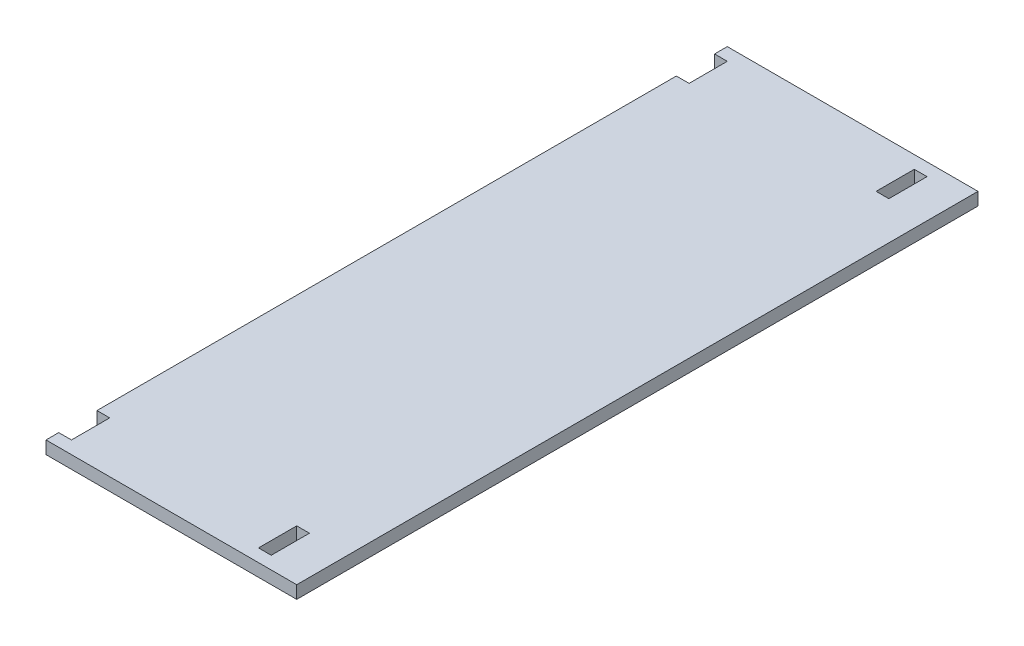
ISO-10303-21;
HEADER;
FILE_DESCRIPTION(('STEP AP214'),'2;1');
FILE_NAME('part.step','',(''),(''),'','','');
FILE_SCHEMA(('AUTOMOTIVE_DESIGN { 1 0 10303 214 1 1 1 1 }'));
ENDSEC;
DATA;
#1=APPLICATION_CONTEXT('core data for automotive mechanical design processes');
#2=APPLICATION_PROTOCOL_DEFINITION('international standard','automotive_design',2000,#1);
#3=PRODUCT_CONTEXT('',#1,'mechanical');
#4=PRODUCT('Part','Part','',(#3));
#5=PRODUCT_RELATED_PRODUCT_CATEGORY('part','',(#4));
#6=PRODUCT_DEFINITION_FORMATION('','',#4);
#7=PRODUCT_DEFINITION_CONTEXT('part definition',#1,'design');
#8=PRODUCT_DEFINITION('design','',#6,#7);
#9=PRODUCT_DEFINITION_SHAPE('','',#8);
#10=(LENGTH_UNIT() NAMED_UNIT(*) SI_UNIT(.MILLI.,.METRE.));
#11=(NAMED_UNIT(*) PLANE_ANGLE_UNIT() SI_UNIT($,.RADIAN.));
#12=(NAMED_UNIT(*) SI_UNIT($,.STERADIAN.) SOLID_ANGLE_UNIT());
#13=UNCERTAINTY_MEASURE_WITH_UNIT(LENGTH_MEASURE(1.E-05),#10,'distance_accuracy_value','');
#14=(GEOMETRIC_REPRESENTATION_CONTEXT(3) GLOBAL_UNCERTAINTY_ASSIGNED_CONTEXT((#13)) GLOBAL_UNIT_ASSIGNED_CONTEXT((#10,
#11,#12)) REPRESENTATION_CONTEXT('',''));
#15=CARTESIAN_POINT('',(0.,0.,0.));
#16=DIRECTION('',(0.,0.,1.));
#17=DIRECTION('',(1.,0.,0.));
#18=AXIS2_PLACEMENT_3D('',#15,#16,#17);
#19=CARTESIAN_POINT('',(0.,3.175,0.));
#20=DIRECTION('',(0.,1.,0.));
#21=DIRECTION('',(0.,0.,1.));
#22=AXIS2_PLACEMENT_3D('',#19,#20,#21);
#23=PLANE('',#22);
#24=DIRECTION('',(0.,0.,1.));
#25=VECTOR('',#24,1.);
#26=CARTESIAN_POINT('',(-31.242,3.175,-84.8995));
#27=LINE('',#26,#25);
#28=CARTESIAN_POINT('',(-31.242,3.175,-84.8995));
#29=VERTEX_POINT('',#28);
#30=CARTESIAN_POINT('',(-31.242,3.175,-81.7245));
#31=VERTEX_POINT('',#30);
#32=EDGE_CURVE('E237',#29,#31,#27,.T.);
#33=ORIENTED_EDGE('',*,*,#32,.T.);
#34=DIRECTION('',(1.,0.,0.));
#35=VECTOR('',#34,1.);
#36=CARTESIAN_POINT('',(-31.242,3.175,-81.7245));
#37=LINE('',#36,#35);
#38=CARTESIAN_POINT('',(-28.067,3.175,-81.7245));
#39=VERTEX_POINT('',#38);
#40=EDGE_CURVE('E240',#31,#39,#37,.T.);
#41=ORIENTED_EDGE('',*,*,#40,.T.);
#42=DIRECTION('',(0.,0.,1.));
#43=VECTOR('',#42,1.);
#44=CARTESIAN_POINT('',(-28.067,3.175,-72.1995));
#45=LINE('',#44,#43);
#46=CARTESIAN_POINT('',(-28.067,3.175,-72.1995));
#47=VERTEX_POINT('',#46);
#48=EDGE_CURVE('E243',#39,#47,#45,.T.);
#49=ORIENTED_EDGE('',*,*,#48,.T.);
#50=DIRECTION('',(-1.,0.,0.));
#51=VECTOR('',#50,1.);
#52=CARTESIAN_POINT('',(-31.242,3.175,-72.1995));
#53=LINE('',#52,#51);
#54=CARTESIAN_POINT('',(-31.242,3.175,-72.1995));
#55=VERTEX_POINT('',#54);
#56=EDGE_CURVE('E245',#47,#55,#53,.T.);
#57=ORIENTED_EDGE('',*,*,#56,.T.);
#58=DIRECTION('',(0.,0.,1.));
#59=VECTOR('',#58,1.);
#60=CARTESIAN_POINT('',(-31.242,3.175,-72.1995));
#61=LINE('',#60,#59);
#62=CARTESIAN_POINT('',(-31.242,3.175,72.1995));
#63=VERTEX_POINT('',#62);
#64=EDGE_CURVE('E247',#55,#63,#61,.T.);
#65=ORIENTED_EDGE('',*,*,#64,.T.);
#66=DIRECTION('',(1.,0.,0.));
#67=VECTOR('',#66,1.);
#68=CARTESIAN_POINT('',(-31.242,3.175,72.1995));
#69=LINE('',#68,#67);
#70=CARTESIAN_POINT('',(-28.067,3.175,72.1995));
#71=VERTEX_POINT('',#70);
#72=EDGE_CURVE('E249',#63,#71,#69,.T.);
#73=ORIENTED_EDGE('',*,*,#72,.T.);
#74=DIRECTION('',(0.,0.,1.));
#75=VECTOR('',#74,1.);
#76=CARTESIAN_POINT('',(-28.067,3.175,72.1995));
#77=LINE('',#76,#75);
#78=CARTESIAN_POINT('',(-28.067,3.175,81.7245));
#79=VERTEX_POINT('',#78);
#80=EDGE_CURVE('E251',#71,#79,#77,.T.);
#81=ORIENTED_EDGE('',*,*,#80,.T.);
#82=DIRECTION('',(-1.,0.,0.));
#83=VECTOR('',#82,1.);
#84=CARTESIAN_POINT('',(-31.242,3.175,81.7245));
#85=LINE('',#84,#83);
#86=CARTESIAN_POINT('',(-31.242,3.175,81.7245));
#87=VERTEX_POINT('',#86);
#88=EDGE_CURVE('E253',#79,#87,#85,.T.);
#89=ORIENTED_EDGE('',*,*,#88,.T.);
#90=DIRECTION('',(0.,0.,1.));
#91=VECTOR('',#90,1.);
#92=CARTESIAN_POINT('',(-31.242,3.175,81.7245));
#93=LINE('',#92,#91);
#94=CARTESIAN_POINT('',(-31.242,3.175,84.8995));
#95=VERTEX_POINT('',#94);
#96=EDGE_CURVE('E255',#87,#95,#93,.T.);
#97=ORIENTED_EDGE('',*,*,#96,.T.);
#98=DIRECTION('',(1.,0.,0.));
#99=VECTOR('',#98,1.);
#100=CARTESIAN_POINT('',(-31.242,3.175,84.8995));
#101=LINE('',#100,#99);
#102=CARTESIAN_POINT('',(31.242,3.175,84.8995));
#103=VERTEX_POINT('',#102);
#104=EDGE_CURVE('E257',#95,#103,#101,.T.);
#105=ORIENTED_EDGE('',*,*,#104,.T.);
#106=DIRECTION('',(0.,0.,-1.));
#107=VECTOR('',#106,1.);
#108=CARTESIAN_POINT('',(31.242,3.175,-84.8995));
#109=LINE('',#108,#107);
#110=CARTESIAN_POINT('',(31.242,3.175,-84.8995));
#111=VERTEX_POINT('',#110);
#112=EDGE_CURVE('E259',#103,#111,#109,.T.);
#113=ORIENTED_EDGE('',*,*,#112,.T.);
#114=DIRECTION('',(-1.,0.,0.));
#115=VECTOR('',#114,1.);
#116=CARTESIAN_POINT('',(-31.242,3.175,-84.8995));
#117=LINE('',#116,#115);
#118=EDGE_CURVE('E261',#111,#29,#117,.T.);
#119=ORIENTED_EDGE('',*,*,#118,.T.);
#120=EDGE_LOOP('',(#33,#41,#49,#57,#65,#73,#81,#89,#97,#105,#113,#119));
#121=FACE_BOUND('',#120,.T.);
#122=DIRECTION('',(0.,0.,-1.));
#123=VECTOR('',#122,1.);
#124=CARTESIAN_POINT('',(21.717,3.175,-72.1995));
#125=LINE('',#124,#123);
#126=CARTESIAN_POINT('',(21.717,3.175,-72.1995));
#127=VERTEX_POINT('',#126);
#128=CARTESIAN_POINT('',(21.717,3.175,-81.7245));
#129=VERTEX_POINT('',#128);
#130=EDGE_CURVE('E208',#127,#129,#125,.T.);
#131=ORIENTED_EDGE('',*,*,#130,.F.);
#132=DIRECTION('',(1.,0.,0.));
#133=VECTOR('',#132,1.);
#134=CARTESIAN_POINT('',(18.542,3.175,-72.1995));
#135=LINE('',#134,#133);
#136=CARTESIAN_POINT('',(18.542,3.175,-72.1995));
#137=VERTEX_POINT('',#136);
#138=EDGE_CURVE('E206',#137,#127,#135,.T.);
#139=ORIENTED_EDGE('',*,*,#138,.F.);
#140=DIRECTION('',(0.,0.,1.));
#141=VECTOR('',#140,1.);
#142=CARTESIAN_POINT('',(18.542,3.175,-81.7245));
#143=LINE('',#142,#141);
#144=CARTESIAN_POINT('',(18.542,3.175,-81.7245));
#145=VERTEX_POINT('',#144);
#146=EDGE_CURVE('E214',#145,#137,#143,.T.);
#147=ORIENTED_EDGE('',*,*,#146,.F.);
#148=DIRECTION('',(-1.,0.,0.));
#149=VECTOR('',#148,1.);
#150=CARTESIAN_POINT('',(18.542,3.175,-81.7245));
#151=LINE('',#150,#149);
#152=EDGE_CURVE('E211',#129,#145,#151,.T.);
#153=ORIENTED_EDGE('',*,*,#152,.F.);
#154=EDGE_LOOP('',(#131,#139,#147,#153));
#155=FACE_BOUND('',#154,.T.);
#156=DIRECTION('',(0.,0.,1.));
#157=VECTOR('',#156,1.);
#158=CARTESIAN_POINT('',(18.542,3.175,81.7245));
#159=LINE('',#158,#157);
#160=CARTESIAN_POINT('',(18.542,3.175,72.1995));
#161=VERTEX_POINT('',#160);
#162=CARTESIAN_POINT('',(18.542,3.175,81.7245));
#163=VERTEX_POINT('',#162);
#164=EDGE_CURVE('E178',#161,#163,#159,.T.);
#165=ORIENTED_EDGE('',*,*,#164,.F.);
#166=DIRECTION('',(-1.,0.,0.));
#167=VECTOR('',#166,1.);
#168=CARTESIAN_POINT('',(18.542,3.175,72.1995));
#169=LINE('',#168,#167);
#170=CARTESIAN_POINT('',(21.717,3.175,72.1995));
#171=VERTEX_POINT('',#170);
#172=EDGE_CURVE('E170',#171,#161,#169,.T.);
#173=ORIENTED_EDGE('',*,*,#172,.F.);
#174=DIRECTION('',(0.,0.,-1.));
#175=VECTOR('',#174,1.);
#176=CARTESIAN_POINT('',(21.717,3.175,72.1995));
#177=LINE('',#176,#175);
#178=CARTESIAN_POINT('',(21.717,3.175,81.7245));
#179=VERTEX_POINT('',#178);
#180=EDGE_CURVE('E192',#179,#171,#177,.T.);
#181=ORIENTED_EDGE('',*,*,#180,.F.);
#182=DIRECTION('',(1.,0.,0.));
#183=VECTOR('',#182,1.);
#184=CARTESIAN_POINT('',(18.542,3.175,81.7245));
#185=LINE('',#184,#183);
#186=EDGE_CURVE('E190',#163,#179,#185,.T.);
#187=ORIENTED_EDGE('',*,*,#186,.F.);
#188=EDGE_LOOP('',(#165,#173,#181,#187));
#189=FACE_BOUND('',#188,.T.);
#190=ADVANCED_FACE('F33',(#121,#155,#189),#23,.T.);
#191=CARTESIAN_POINT('',(0.,0.,0.));
#192=DIRECTION('',(0.,1.,0.));
#193=DIRECTION('',(0.,0.,1.));
#194=AXIS2_PLACEMENT_3D('',#191,#192,#193);
#195=PLANE('',#194);
#196=DIRECTION('',(1.,0.,0.));
#197=VECTOR('',#196,1.);
#198=CARTESIAN_POINT('',(18.542,0.,-72.1995));
#199=LINE('',#198,#197);
#200=CARTESIAN_POINT('',(18.542,0.,-72.1995));
#201=VERTEX_POINT('',#200);
#202=CARTESIAN_POINT('',(21.717,0.,-72.1995));
#203=VERTEX_POINT('',#202);
#204=EDGE_CURVE('E186',#201,#203,#199,.T.);
#205=ORIENTED_EDGE('',*,*,#204,.T.);
#206=DIRECTION('',(0.,0.,-1.));
#207=VECTOR('',#206,1.);
#208=CARTESIAN_POINT('',(21.717,0.,-72.1995));
#209=LINE('',#208,#207);
#210=CARTESIAN_POINT('',(21.717,0.,-81.7245));
#211=VERTEX_POINT('',#210);
#212=EDGE_CURVE('E219',#203,#211,#209,.T.);
#213=ORIENTED_EDGE('',*,*,#212,.T.);
#214=DIRECTION('',(-1.,0.,0.));
#215=VECTOR('',#214,1.);
#216=CARTESIAN_POINT('',(18.542,0.,-81.7245));
#217=LINE('',#216,#215);
#218=CARTESIAN_POINT('',(18.542,0.,-81.7245));
#219=VERTEX_POINT('',#218);
#220=EDGE_CURVE('E222',#211,#219,#217,.T.);
#221=ORIENTED_EDGE('',*,*,#220,.T.);
#222=DIRECTION('',(0.,0.,1.));
#223=VECTOR('',#222,1.);
#224=CARTESIAN_POINT('',(18.542,0.,-81.7245));
#225=LINE('',#224,#223);
#226=EDGE_CURVE('E209',#219,#201,#225,.T.);
#227=ORIENTED_EDGE('',*,*,#226,.T.);
#228=EDGE_LOOP('',(#205,#213,#221,#227));
#229=FACE_BOUND('',#228,.T.);
#230=DIRECTION('',(0.,0.,1.));
#231=VECTOR('',#230,1.);
#232=CARTESIAN_POINT('',(-31.242,0.,-84.8995));
#233=LINE('',#232,#231);
#234=CARTESIAN_POINT('',(-31.242,0.,-84.8995));
#235=VERTEX_POINT('',#234);
#236=CARTESIAN_POINT('',(-31.242,0.,-81.7245));
#237=VERTEX_POINT('',#236);
#238=EDGE_CURVE('E236',#235,#237,#233,.T.);
#239=ORIENTED_EDGE('',*,*,#238,.F.);
#240=DIRECTION('',(-1.,0.,0.));
#241=VECTOR('',#240,1.);
#242=CARTESIAN_POINT('',(-31.242,0.,-84.8995));
#243=LINE('',#242,#241);
#244=CARTESIAN_POINT('',(31.242,0.,-84.8995));
#245=VERTEX_POINT('',#244);
#246=EDGE_CURVE('E241',#245,#235,#243,.T.);
#247=ORIENTED_EDGE('',*,*,#246,.F.);
#248=DIRECTION('',(0.,0.,-1.));
#249=VECTOR('',#248,1.);
#250=CARTESIAN_POINT('',(31.242,0.,-84.8995));
#251=LINE('',#250,#249);
#252=CARTESIAN_POINT('',(31.242,0.,84.8995));
#253=VERTEX_POINT('',#252);
#254=EDGE_CURVE('E284',#253,#245,#251,.T.);
#255=ORIENTED_EDGE('',*,*,#254,.F.);
#256=DIRECTION('',(1.,0.,0.));
#257=VECTOR('',#256,1.);
#258=CARTESIAN_POINT('',(-31.242,0.,84.8995));
#259=LINE('',#258,#257);
#260=CARTESIAN_POINT('',(-31.242,0.,84.8995));
#261=VERTEX_POINT('',#260);
#262=EDGE_CURVE('E282',#261,#253,#259,.T.);
#263=ORIENTED_EDGE('',*,*,#262,.F.);
#264=DIRECTION('',(0.,0.,1.));
#265=VECTOR('',#264,1.);
#266=CARTESIAN_POINT('',(-31.242,0.,81.7245));
#267=LINE('',#266,#265);
#268=CARTESIAN_POINT('',(-31.242,0.,81.7245));
#269=VERTEX_POINT('',#268);
#270=EDGE_CURVE('E280',#269,#261,#267,.T.);
#271=ORIENTED_EDGE('',*,*,#270,.F.);
#272=DIRECTION('',(-1.,0.,0.));
#273=VECTOR('',#272,1.);
#274=CARTESIAN_POINT('',(-31.242,0.,81.7245));
#275=LINE('',#274,#273);
#276=CARTESIAN_POINT('',(-28.067,0.,81.7245));
#277=VERTEX_POINT('',#276);
#278=EDGE_CURVE('E278',#277,#269,#275,.T.);
#279=ORIENTED_EDGE('',*,*,#278,.F.);
#280=DIRECTION('',(0.,0.,1.));
#281=VECTOR('',#280,1.);
#282=CARTESIAN_POINT('',(-28.067,0.,72.1995));
#283=LINE('',#282,#281);
#284=CARTESIAN_POINT('',(-28.067,0.,72.1995));
#285=VERTEX_POINT('',#284);
#286=EDGE_CURVE('E276',#285,#277,#283,.T.);
#287=ORIENTED_EDGE('',*,*,#286,.F.);
#288=DIRECTION('',(1.,0.,0.));
#289=VECTOR('',#288,1.);
#290=CARTESIAN_POINT('',(-31.242,0.,72.1995));
#291=LINE('',#290,#289);
#292=CARTESIAN_POINT('',(-31.242,0.,72.1995));
#293=VERTEX_POINT('',#292);
#294=EDGE_CURVE('E274',#293,#285,#291,.T.);
#295=ORIENTED_EDGE('',*,*,#294,.F.);
#296=DIRECTION('',(0.,0.,1.));
#297=VECTOR('',#296,1.);
#298=CARTESIAN_POINT('',(-31.242,0.,-72.1995));
#299=LINE('',#298,#297);
#300=CARTESIAN_POINT('',(-31.242,0.,-72.1995));
#301=VERTEX_POINT('',#300);
#302=EDGE_CURVE('E272',#301,#293,#299,.T.);
#303=ORIENTED_EDGE('',*,*,#302,.F.);
#304=DIRECTION('',(-1.,0.,0.));
#305=VECTOR('',#304,1.);
#306=CARTESIAN_POINT('',(-31.242,0.,-72.1995));
#307=LINE('',#306,#305);
#308=CARTESIAN_POINT('',(-28.067,0.,-72.1995));
#309=VERTEX_POINT('',#308);
#310=EDGE_CURVE('E270',#309,#301,#307,.T.);
#311=ORIENTED_EDGE('',*,*,#310,.F.);
#312=DIRECTION('',(0.,0.,1.));
#313=VECTOR('',#312,1.);
#314=CARTESIAN_POINT('',(-28.067,0.,-72.1995));
#315=LINE('',#314,#313);
#316=CARTESIAN_POINT('',(-28.067,0.,-81.7245));
#317=VERTEX_POINT('',#316);
#318=EDGE_CURVE('E268',#317,#309,#315,.T.);
#319=ORIENTED_EDGE('',*,*,#318,.F.);
#320=DIRECTION('',(1.,0.,0.));
#321=VECTOR('',#320,1.);
#322=CARTESIAN_POINT('',(-31.242,0.,-81.7245));
#323=LINE('',#322,#321);
#324=EDGE_CURVE('E266',#237,#317,#323,.T.);
#325=ORIENTED_EDGE('',*,*,#324,.F.);
#326=EDGE_LOOP('',(#239,#247,#255,#263,#271,#279,#287,#295,#303,#311,#319,#325));
#327=FACE_BOUND('',#326,.T.);
#328=DIRECTION('',(-1.,0.,0.));
#329=VECTOR('',#328,1.);
#330=CARTESIAN_POINT('',(18.542,0.,72.1995));
#331=LINE('',#330,#329);
#332=CARTESIAN_POINT('',(21.717,0.,72.1995));
#333=VERTEX_POINT('',#332);
#334=CARTESIAN_POINT('',(18.542,0.,72.1995));
#335=VERTEX_POINT('',#334);
#336=EDGE_CURVE('E56',#333,#335,#331,.T.);
#337=ORIENTED_EDGE('',*,*,#336,.T.);
#338=DIRECTION('',(0.,0.,1.));
#339=VECTOR('',#338,1.);
#340=CARTESIAN_POINT('',(18.542,0.,81.7245));
#341=LINE('',#340,#339);
#342=CARTESIAN_POINT('',(18.542,0.,81.7245));
#343=VERTEX_POINT('',#342);
#344=EDGE_CURVE('E185',#335,#343,#341,.T.);
#345=ORIENTED_EDGE('',*,*,#344,.T.);
#346=DIRECTION('',(1.,0.,0.));
#347=VECTOR('',#346,1.);
#348=CARTESIAN_POINT('',(18.542,0.,81.7245));
#349=LINE('',#348,#347);
#350=CARTESIAN_POINT('',(21.717,0.,81.7245));
#351=VERTEX_POINT('',#350);
#352=EDGE_CURVE('E198',#343,#351,#349,.T.);
#353=ORIENTED_EDGE('',*,*,#352,.T.);
#354=DIRECTION('',(0.,0.,-1.));
#355=VECTOR('',#354,1.);
#356=CARTESIAN_POINT('',(21.717,0.,72.1995));
#357=LINE('',#356,#355);
#358=EDGE_CURVE('E179',#351,#333,#357,.T.);
#359=ORIENTED_EDGE('',*,*,#358,.T.);
#360=EDGE_LOOP('',(#337,#345,#353,#359));
#361=FACE_BOUND('',#360,.T.);
#362=ADVANCED_FACE('F326',(#229,#327,#361),#195,.F.);
#363=CARTESIAN_POINT('',(-31.242,3.175,-84.8995));
#364=DIRECTION('',(1.,0.,0.));
#365=DIRECTION('',(0.,0.,-1.));
#366=AXIS2_PLACEMENT_3D('',#363,#364,#365);
#367=PLANE('',#366);
#368=ORIENTED_EDGE('',*,*,#238,.T.);
#369=DIRECTION('',(0.,-1.,0.));
#370=VECTOR('',#369,1.);
#371=CARTESIAN_POINT('',(-31.242,3.175,-81.7245));
#372=LINE('',#371,#370);
#373=EDGE_CURVE('E11',#31,#237,#372,.T.);
#374=ORIENTED_EDGE('',*,*,#373,.F.);
#375=ORIENTED_EDGE('',*,*,#32,.F.);
#376=DIRECTION('',(0.,-1.,0.));
#377=VECTOR('',#376,1.);
#378=CARTESIAN_POINT('',(-31.242,3.175,-84.8995));
#379=LINE('',#378,#377);
#380=EDGE_CURVE('E263',#29,#235,#379,.T.);
#381=ORIENTED_EDGE('',*,*,#380,.T.);
#382=EDGE_LOOP('',(#368,#374,#375,#381));
#383=FACE_BOUND('',#382,.T.);
#384=ADVANCED_FACE('F35',(#383),#367,.F.);
#385=CARTESIAN_POINT('',(-31.242,3.175,-81.7245));
#386=DIRECTION('',(0.,0.,-1.));
#387=DIRECTION('',(-1.,0.,0.));
#388=AXIS2_PLACEMENT_3D('',#385,#386,#387);
#389=PLANE('',#388);
#390=ORIENTED_EDGE('',*,*,#324,.T.);
#391=DIRECTION('',(0.,-1.,0.));
#392=VECTOR('',#391,1.);
#393=CARTESIAN_POINT('',(-28.067,3.175,-81.7245));
#394=LINE('',#393,#392);
#395=EDGE_CURVE('E41',#39,#317,#394,.T.);
#396=ORIENTED_EDGE('',*,*,#395,.F.);
#397=ORIENTED_EDGE('',*,*,#40,.F.);
#398=ORIENTED_EDGE('',*,*,#373,.T.);
#399=EDGE_LOOP('',(#390,#396,#397,#398));
#400=FACE_BOUND('',#399,.T.);
#401=ADVANCED_FACE('F344',(#400),#389,.F.);
#402=CARTESIAN_POINT('',(-28.067,3.175,-72.1995));
#403=DIRECTION('',(1.,0.,0.));
#404=DIRECTION('',(0.,0.,-1.));
#405=AXIS2_PLACEMENT_3D('',#402,#403,#404);
#406=PLANE('',#405);
#407=ORIENTED_EDGE('',*,*,#318,.T.);
#408=DIRECTION('',(0.,-1.,0.));
#409=VECTOR('',#408,1.);
#410=CARTESIAN_POINT('',(-28.067,3.175,-72.1995));
#411=LINE('',#410,#409);
#412=EDGE_CURVE('E313',#47,#309,#411,.T.);
#413=ORIENTED_EDGE('',*,*,#412,.F.);
#414=ORIENTED_EDGE('',*,*,#48,.F.);
#415=ORIENTED_EDGE('',*,*,#395,.T.);
#416=EDGE_LOOP('',(#407,#413,#414,#415));
#417=FACE_BOUND('',#416,.T.);
#418=ADVANCED_FACE('F320',(#417),#406,.F.);
#419=CARTESIAN_POINT('',(-31.242,3.175,-72.1995));
#420=DIRECTION('',(0.,0.,1.));
#421=DIRECTION('',(1.,0.,0.));
#422=AXIS2_PLACEMENT_3D('',#419,#420,#421);
#423=PLANE('',#422);
#424=ORIENTED_EDGE('',*,*,#310,.T.);
#425=DIRECTION('',(0.,-1.,0.));
#426=VECTOR('',#425,1.);
#427=CARTESIAN_POINT('',(-31.242,3.175,-72.1995));
#428=LINE('',#427,#426);
#429=EDGE_CURVE('E310',#55,#301,#428,.T.);
#430=ORIENTED_EDGE('',*,*,#429,.F.);
#431=ORIENTED_EDGE('',*,*,#56,.F.);
#432=ORIENTED_EDGE('',*,*,#412,.T.);
#433=EDGE_LOOP('',(#424,#430,#431,#432));
#434=FACE_BOUND('',#433,.T.);
#435=ADVANCED_FACE('F332',(#434),#423,.F.);
#436=CARTESIAN_POINT('',(-31.242,3.175,-72.1995));
#437=DIRECTION('',(1.,0.,0.));
#438=DIRECTION('',(0.,0.,-1.));
#439=AXIS2_PLACEMENT_3D('',#436,#437,#438);
#440=PLANE('',#439);
#441=ORIENTED_EDGE('',*,*,#302,.T.);
#442=DIRECTION('',(0.,-1.,0.));
#443=VECTOR('',#442,1.);
#444=CARTESIAN_POINT('',(-31.242,3.175,72.1995));
#445=LINE('',#444,#443);
#446=EDGE_CURVE('E307',#63,#293,#445,.T.);
#447=ORIENTED_EDGE('',*,*,#446,.F.);
#448=ORIENTED_EDGE('',*,*,#64,.F.);
#449=ORIENTED_EDGE('',*,*,#429,.T.);
#450=EDGE_LOOP('',(#441,#447,#448,#449));
#451=FACE_BOUND('',#450,.T.);
#452=ADVANCED_FACE('F336',(#451),#440,.F.);
#453=CARTESIAN_POINT('',(-31.242,3.175,72.1995));
#454=DIRECTION('',(0.,0.,-1.));
#455=DIRECTION('',(-1.,0.,0.));
#456=AXIS2_PLACEMENT_3D('',#453,#454,#455);
#457=PLANE('',#456);
#458=ORIENTED_EDGE('',*,*,#294,.T.);
#459=DIRECTION('',(0.,-1.,0.));
#460=VECTOR('',#459,1.);
#461=CARTESIAN_POINT('',(-28.067,3.175,72.1995));
#462=LINE('',#461,#460);
#463=EDGE_CURVE('E304',#71,#285,#462,.T.);
#464=ORIENTED_EDGE('',*,*,#463,.F.);
#465=ORIENTED_EDGE('',*,*,#72,.F.);
#466=ORIENTED_EDGE('',*,*,#446,.T.);
#467=EDGE_LOOP('',(#458,#464,#465,#466));
#468=FACE_BOUND('',#467,.T.);
#469=ADVANCED_FACE('F377',(#468),#457,.F.);
#470=CARTESIAN_POINT('',(-28.067,3.175,72.1995));
#471=DIRECTION('',(1.,0.,0.));
#472=DIRECTION('',(0.,0.,-1.));
#473=AXIS2_PLACEMENT_3D('',#470,#471,#472);
#474=PLANE('',#473);
#475=ORIENTED_EDGE('',*,*,#286,.T.);
#476=DIRECTION('',(0.,-1.,0.));
#477=VECTOR('',#476,1.);
#478=CARTESIAN_POINT('',(-28.067,3.175,81.7245));
#479=LINE('',#478,#477);
#480=EDGE_CURVE('E301',#79,#277,#479,.T.);
#481=ORIENTED_EDGE('',*,*,#480,.F.);
#482=ORIENTED_EDGE('',*,*,#80,.F.);
#483=ORIENTED_EDGE('',*,*,#463,.T.);
#484=EDGE_LOOP('',(#475,#481,#482,#483));
#485=FACE_BOUND('',#484,.T.);
#486=ADVANCED_FACE('F375',(#485),#474,.F.);
#487=CARTESIAN_POINT('',(-31.242,3.175,81.7245));
#488=DIRECTION('',(0.,0.,1.));
#489=DIRECTION('',(1.,0.,0.));
#490=AXIS2_PLACEMENT_3D('',#487,#488,#489);
#491=PLANE('',#490);
#492=ORIENTED_EDGE('',*,*,#278,.T.);
#493=DIRECTION('',(0.,-1.,0.));
#494=VECTOR('',#493,1.);
#495=CARTESIAN_POINT('',(-31.242,3.175,81.7245));
#496=LINE('',#495,#494);
#497=EDGE_CURVE('E298',#87,#269,#496,.T.);
#498=ORIENTED_EDGE('',*,*,#497,.F.);
#499=ORIENTED_EDGE('',*,*,#88,.F.);
#500=ORIENTED_EDGE('',*,*,#480,.T.);
#501=EDGE_LOOP('',(#492,#498,#499,#500));
#502=FACE_BOUND('',#501,.T.);
#503=ADVANCED_FACE('F371',(#502),#491,.F.);
#504=CARTESIAN_POINT('',(-31.242,3.175,81.7245));
#505=DIRECTION('',(1.,0.,0.));
#506=DIRECTION('',(0.,0.,-1.));
#507=AXIS2_PLACEMENT_3D('',#504,#505,#506);
#508=PLANE('',#507);
#509=ORIENTED_EDGE('',*,*,#270,.T.);
#510=DIRECTION('',(0.,-1.,0.));
#511=VECTOR('',#510,1.);
#512=CARTESIAN_POINT('',(-31.242,3.175,84.8995));
#513=LINE('',#512,#511);
#514=EDGE_CURVE('E295',#95,#261,#513,.T.);
#515=ORIENTED_EDGE('',*,*,#514,.F.);
#516=ORIENTED_EDGE('',*,*,#96,.F.);
#517=ORIENTED_EDGE('',*,*,#497,.T.);
#518=EDGE_LOOP('',(#509,#515,#516,#517));
#519=FACE_BOUND('',#518,.T.);
#520=ADVANCED_FACE('F366',(#519),#508,.F.);
#521=CARTESIAN_POINT('',(-31.242,3.175,84.8995));
#522=DIRECTION('',(0.,0.,-1.));
#523=DIRECTION('',(-1.,0.,0.));
#524=AXIS2_PLACEMENT_3D('',#521,#522,#523);
#525=PLANE('',#524);
#526=ORIENTED_EDGE('',*,*,#262,.T.);
#527=DIRECTION('',(0.,-1.,0.));
#528=VECTOR('',#527,1.);
#529=CARTESIAN_POINT('',(31.242,3.175,84.8995));
#530=LINE('',#529,#528);
#531=EDGE_CURVE('E292',#103,#253,#530,.T.);
#532=ORIENTED_EDGE('',*,*,#531,.F.);
#533=ORIENTED_EDGE('',*,*,#104,.F.);
#534=ORIENTED_EDGE('',*,*,#514,.T.);
#535=EDGE_LOOP('',(#526,#532,#533,#534));
#536=FACE_BOUND('',#535,.T.);
#537=ADVANCED_FACE('F360',(#536),#525,.F.);
#538=CARTESIAN_POINT('',(31.242,3.175,-84.8995));
#539=DIRECTION('',(-1.,0.,0.));
#540=DIRECTION('',(0.,0.,1.));
#541=AXIS2_PLACEMENT_3D('',#538,#539,#540);
#542=PLANE('',#541);
#543=ORIENTED_EDGE('',*,*,#254,.T.);
#544=DIRECTION('',(0.,-1.,0.));
#545=VECTOR('',#544,1.);
#546=CARTESIAN_POINT('',(31.242,3.175,-84.8995));
#547=LINE('',#546,#545);
#548=EDGE_CURVE('E289',#111,#245,#547,.T.);
#549=ORIENTED_EDGE('',*,*,#548,.F.);
#550=ORIENTED_EDGE('',*,*,#112,.F.);
#551=ORIENTED_EDGE('',*,*,#531,.T.);
#552=EDGE_LOOP('',(#543,#549,#550,#551));
#553=FACE_BOUND('',#552,.T.);
#554=ADVANCED_FACE('F356',(#553),#542,.F.);
#555=CARTESIAN_POINT('',(-31.242,3.175,-84.8995));
#556=DIRECTION('',(0.,0.,1.));
#557=DIRECTION('',(1.,0.,0.));
#558=AXIS2_PLACEMENT_3D('',#555,#556,#557);
#559=PLANE('',#558);
#560=ORIENTED_EDGE('',*,*,#246,.T.);
#561=ORIENTED_EDGE('',*,*,#380,.F.);
#562=ORIENTED_EDGE('',*,*,#118,.F.);
#563=ORIENTED_EDGE('',*,*,#548,.T.);
#564=EDGE_LOOP('',(#560,#561,#562,#563));
#565=FACE_BOUND('',#564,.T.);
#566=ADVANCED_FACE('F351',(#565),#559,.F.);
#567=CARTESIAN_POINT('',(18.542,3.175,-72.1995));
#568=DIRECTION('',(0.,0.,-1.));
#569=DIRECTION('',(-1.,0.,0.));
#570=AXIS2_PLACEMENT_3D('',#567,#568,#569);
#571=PLANE('',#570);
#572=ORIENTED_EDGE('',*,*,#204,.F.);
#573=DIRECTION('',(0.,-1.,0.));
#574=VECTOR('',#573,1.);
#575=CARTESIAN_POINT('',(18.542,3.175,-72.1995));
#576=LINE('',#575,#574);
#577=EDGE_CURVE('E216',#137,#201,#576,.T.);
#578=ORIENTED_EDGE('',*,*,#577,.F.);
#579=ORIENTED_EDGE('',*,*,#138,.T.);
#580=DIRECTION('',(0.,-1.,0.));
#581=VECTOR('',#580,1.);
#582=CARTESIAN_POINT('',(21.717,3.175,-72.1995));
#583=LINE('',#582,#581);
#584=EDGE_CURVE('E233',#127,#203,#583,.T.);
#585=ORIENTED_EDGE('',*,*,#584,.T.);
#586=EDGE_LOOP('',(#572,#578,#579,#585));
#587=FACE_BOUND('',#586,.T.);
#588=ADVANCED_FACE('F394',(#587),#571,.T.);
#589=CARTESIAN_POINT('',(21.717,3.175,-72.1995));
#590=DIRECTION('',(-1.,0.,0.));
#591=DIRECTION('',(0.,0.,1.));
#592=AXIS2_PLACEMENT_3D('',#589,#590,#591);
#593=PLANE('',#592);
#594=ORIENTED_EDGE('',*,*,#212,.F.);
#595=ORIENTED_EDGE('',*,*,#584,.F.);
#596=ORIENTED_EDGE('',*,*,#130,.T.);
#597=DIRECTION('',(0.,-1.,0.));
#598=VECTOR('',#597,1.);
#599=CARTESIAN_POINT('',(21.717,3.175,-81.7245));
#600=LINE('',#599,#598);
#601=EDGE_CURVE('E231',#129,#211,#600,.T.);
#602=ORIENTED_EDGE('',*,*,#601,.T.);
#603=EDGE_LOOP('',(#594,#595,#596,#602));
#604=FACE_BOUND('',#603,.T.);
#605=ADVANCED_FACE('F432',(#604),#593,.T.);
#606=CARTESIAN_POINT('',(18.542,3.175,-81.7245));
#607=DIRECTION('',(0.,0.,1.));
#608=DIRECTION('',(1.,0.,0.));
#609=AXIS2_PLACEMENT_3D('',#606,#607,#608);
#610=PLANE('',#609);
#611=ORIENTED_EDGE('',*,*,#220,.F.);
#612=ORIENTED_EDGE('',*,*,#601,.F.);
#613=ORIENTED_EDGE('',*,*,#152,.T.);
#614=DIRECTION('',(0.,-1.,0.));
#615=VECTOR('',#614,1.);
#616=CARTESIAN_POINT('',(18.542,3.175,-81.7245));
#617=LINE('',#616,#615);
#618=EDGE_CURVE('E229',#145,#219,#617,.T.);
#619=ORIENTED_EDGE('',*,*,#618,.T.);
#620=EDGE_LOOP('',(#611,#612,#613,#619));
#621=FACE_BOUND('',#620,.T.);
#622=ADVANCED_FACE('F439',(#621),#610,.T.);
#623=CARTESIAN_POINT('',(18.542,3.175,-81.7245));
#624=DIRECTION('',(1.,0.,0.));
#625=DIRECTION('',(0.,0.,-1.));
#626=AXIS2_PLACEMENT_3D('',#623,#624,#625);
#627=PLANE('',#626);
#628=ORIENTED_EDGE('',*,*,#226,.F.);
#629=ORIENTED_EDGE('',*,*,#618,.F.);
#630=ORIENTED_EDGE('',*,*,#146,.T.);
#631=ORIENTED_EDGE('',*,*,#577,.T.);
#632=EDGE_LOOP('',(#628,#629,#630,#631));
#633=FACE_BOUND('',#632,.T.);
#634=ADVANCED_FACE('F446',(#633),#627,.T.);
#635=CARTESIAN_POINT('',(18.542,3.175,72.1995));
#636=DIRECTION('',(0.,0.,1.));
#637=DIRECTION('',(1.,0.,0.));
#638=AXIS2_PLACEMENT_3D('',#635,#636,#637);
#639=PLANE('',#638);
#640=ORIENTED_EDGE('',*,*,#336,.F.);
#641=DIRECTION('',(0.,-1.,0.));
#642=VECTOR('',#641,1.);
#643=CARTESIAN_POINT('',(21.717,3.175,72.1995));
#644=LINE('',#643,#642);
#645=EDGE_CURVE('E174',#171,#333,#644,.T.);
#646=ORIENTED_EDGE('',*,*,#645,.F.);
#647=ORIENTED_EDGE('',*,*,#172,.T.);
#648=DIRECTION('',(0.,-1.,0.));
#649=VECTOR('',#648,1.);
#650=CARTESIAN_POINT('',(18.542,3.175,72.1995));
#651=LINE('',#650,#649);
#652=EDGE_CURVE('E173',#161,#335,#651,.T.);
#653=ORIENTED_EDGE('',*,*,#652,.T.);
#654=EDGE_LOOP('',(#640,#646,#647,#653));
#655=FACE_BOUND('',#654,.T.);
#656=ADVANCED_FACE('F172',(#655),#639,.T.);
#657=CARTESIAN_POINT('',(18.542,3.175,81.7245));
#658=DIRECTION('',(1.,0.,0.));
#659=DIRECTION('',(0.,0.,-1.));
#660=AXIS2_PLACEMENT_3D('',#657,#658,#659);
#661=PLANE('',#660);
#662=ORIENTED_EDGE('',*,*,#344,.F.);
#663=ORIENTED_EDGE('',*,*,#652,.F.);
#664=ORIENTED_EDGE('',*,*,#164,.T.);
#665=DIRECTION('',(0.,-1.,0.));
#666=VECTOR('',#665,1.);
#667=CARTESIAN_POINT('',(18.542,3.175,81.7245));
#668=LINE('',#667,#666);
#669=EDGE_CURVE('E187',#163,#343,#668,.T.);
#670=ORIENTED_EDGE('',*,*,#669,.T.);
#671=EDGE_LOOP('',(#662,#663,#664,#670));
#672=FACE_BOUND('',#671,.T.);
#673=ADVANCED_FACE('F182',(#672),#661,.T.);
#674=CARTESIAN_POINT('',(18.542,3.175,81.7245));
#675=DIRECTION('',(0.,0.,-1.));
#676=DIRECTION('',(-1.,0.,0.));
#677=AXIS2_PLACEMENT_3D('',#674,#675,#676);
#678=PLANE('',#677);
#679=ORIENTED_EDGE('',*,*,#352,.F.);
#680=ORIENTED_EDGE('',*,*,#669,.F.);
#681=ORIENTED_EDGE('',*,*,#186,.T.);
#682=DIRECTION('',(0.,-1.,0.));
#683=VECTOR('',#682,1.);
#684=CARTESIAN_POINT('',(21.717,3.175,81.7245));
#685=LINE('',#684,#683);
#686=EDGE_CURVE('E48',#179,#351,#685,.T.);
#687=ORIENTED_EDGE('',*,*,#686,.T.);
#688=EDGE_LOOP('',(#679,#680,#681,#687));
#689=FACE_BOUND('',#688,.T.);
#690=ADVANCED_FACE('F467',(#689),#678,.T.);
#691=CARTESIAN_POINT('',(21.717,3.175,72.1995));
#692=DIRECTION('',(-1.,0.,0.));
#693=DIRECTION('',(0.,0.,1.));
#694=AXIS2_PLACEMENT_3D('',#691,#692,#693);
#695=PLANE('',#694);
#696=ORIENTED_EDGE('',*,*,#358,.F.);
#697=ORIENTED_EDGE('',*,*,#686,.F.);
#698=ORIENTED_EDGE('',*,*,#180,.T.);
#699=ORIENTED_EDGE('',*,*,#645,.T.);
#700=EDGE_LOOP('',(#696,#697,#698,#699));
#701=FACE_BOUND('',#700,.T.);
#702=ADVANCED_FACE('F474',(#701),#695,.T.);
#703=CLOSED_SHELL('',(#190,#362,#384,#401,#418,#435,#452,#469,#486,#503,#520,#537,#554,#566,
#588,#605,#622,#634,#656,#673,#690,#702));
#704=MANIFOLD_SOLID_BREP('B2',#703);
#705=ADVANCED_BREP_SHAPE_REPRESENTATION('',(#18,#704),#14);
#706=SHAPE_DEFINITION_REPRESENTATION(#9,#705);
ENDSEC;
END-ISO-10303-21;
